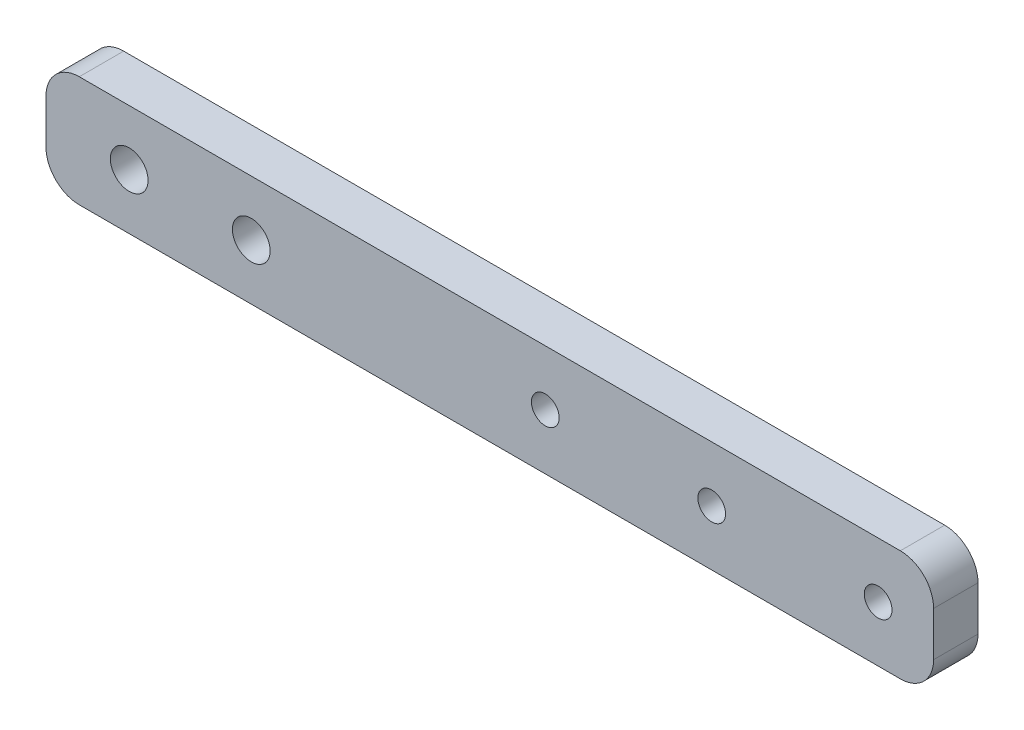
ISO-10303-21;
HEADER;
FILE_DESCRIPTION(('STEP AP214'),'2;1');
FILE_NAME('part.step','',(''),(''),'','','');
FILE_SCHEMA(('AUTOMOTIVE_DESIGN { 1 0 10303 214 1 1 1 1 }'));
ENDSEC;
DATA;
#1=APPLICATION_CONTEXT('core data for automotive mechanical design processes');
#2=APPLICATION_PROTOCOL_DEFINITION('international standard','automotive_design',2000,#1);
#3=PRODUCT_CONTEXT('',#1,'mechanical');
#4=PRODUCT('Part','Part','',(#3));
#5=PRODUCT_RELATED_PRODUCT_CATEGORY('part','',(#4));
#6=PRODUCT_DEFINITION_FORMATION('','',#4);
#7=PRODUCT_DEFINITION_CONTEXT('part definition',#1,'design');
#8=PRODUCT_DEFINITION('design','',#6,#7);
#9=PRODUCT_DEFINITION_SHAPE('','',#8);
#10=(LENGTH_UNIT() NAMED_UNIT(*) SI_UNIT(.MILLI.,.METRE.));
#11=(NAMED_UNIT(*) PLANE_ANGLE_UNIT() SI_UNIT($,.RADIAN.));
#12=(NAMED_UNIT(*) SI_UNIT($,.STERADIAN.) SOLID_ANGLE_UNIT());
#13=UNCERTAINTY_MEASURE_WITH_UNIT(LENGTH_MEASURE(1.E-05),#10,'distance_accuracy_value','');
#14=(GEOMETRIC_REPRESENTATION_CONTEXT(3) GLOBAL_UNCERTAINTY_ASSIGNED_CONTEXT((#13)) GLOBAL_UNIT_ASSIGNED_CONTEXT((#10,
#11,#12)) REPRESENTATION_CONTEXT('',''));
#15=CARTESIAN_POINT('',(0.,0.,0.));
#16=DIRECTION('',(0.,0.,1.));
#17=DIRECTION('',(1.,0.,0.));
#18=AXIS2_PLACEMENT_3D('',#15,#16,#17);
#19=CARTESIAN_POINT('',(0.,0.,4.));
#20=DIRECTION('',(0.,0.,-1.));
#21=DIRECTION('',(-1.,0.,0.));
#22=AXIS2_PLACEMENT_3D('',#19,#20,#21);
#23=PLANE('',#22);
#24=DIRECTION('',(1.,0.,0.));
#25=VECTOR('',#24,1.);
#26=CARTESIAN_POINT('',(0.,0.,4.));
#27=LINE('',#26,#25);
#28=CARTESIAN_POINT('',(3.,0.,4.));
#29=VERTEX_POINT('',#28);
#30=CARTESIAN_POINT('',(77.,0.,4.));
#31=VERTEX_POINT('',#30);
#32=EDGE_CURVE('E177',#29,#31,#27,.T.);
#33=ORIENTED_EDGE('',*,*,#32,.T.);
#34=CARTESIAN_POINT('',(77.,3.00000000000001,4.));
#35=DIRECTION('',(0.,0.,-1.));
#36=DIRECTION('',(-1.,0.,0.));
#37=AXIS2_PLACEMENT_3D('',#34,#35,#36);
#38=CIRCLE('',#37,3.);
#39=CARTESIAN_POINT('',(80.,3.00000000000001,4.));
#40=VERTEX_POINT('',#39);
#41=EDGE_CURVE('E154',#31,#40,#38,.F.);
#42=ORIENTED_EDGE('',*,*,#41,.T.);
#43=DIRECTION('',(0.,1.,0.));
#44=VECTOR('',#43,1.);
#45=CARTESIAN_POINT('',(80.,0.,4.));
#46=LINE('',#45,#44);
#47=CARTESIAN_POINT('',(80.,7.00000000000001,4.));
#48=VERTEX_POINT('',#47);
#49=EDGE_CURVE('E124',#40,#48,#46,.T.);
#50=ORIENTED_EDGE('',*,*,#49,.T.);
#51=CARTESIAN_POINT('',(77.,7.00000000000001,4.));
#52=DIRECTION('',(0.,0.,-1.));
#53=DIRECTION('',(-1.,0.,0.));
#54=AXIS2_PLACEMENT_3D('',#51,#52,#53);
#55=CIRCLE('',#54,3.);
#56=CARTESIAN_POINT('',(77.,10.,4.));
#57=VERTEX_POINT('',#56);
#58=EDGE_CURVE('E61',#48,#57,#55,.F.);
#59=ORIENTED_EDGE('',*,*,#58,.T.);
#60=DIRECTION('',(-1.,0.,0.));
#61=VECTOR('',#60,1.);
#62=CARTESIAN_POINT('',(0.,10.,4.));
#63=LINE('',#62,#61);
#64=CARTESIAN_POINT('',(3.,10.,4.));
#65=VERTEX_POINT('',#64);
#66=EDGE_CURVE('E140',#57,#65,#63,.T.);
#67=ORIENTED_EDGE('',*,*,#66,.T.);
#68=CARTESIAN_POINT('',(3.,7.,4.));
#69=DIRECTION('',(0.,0.,-1.));
#70=DIRECTION('',(-1.,0.,0.));
#71=AXIS2_PLACEMENT_3D('',#68,#69,#70);
#72=CIRCLE('',#71,3.);
#73=CARTESIAN_POINT('',(0.,7.,4.));
#74=VERTEX_POINT('',#73);
#75=EDGE_CURVE('E149',#65,#74,#72,.F.);
#76=ORIENTED_EDGE('',*,*,#75,.T.);
#77=DIRECTION('',(0.,-1.,0.));
#78=VECTOR('',#77,1.);
#79=CARTESIAN_POINT('',(0.,0.,4.));
#80=LINE('',#79,#78);
#81=CARTESIAN_POINT('',(0.,3.,4.));
#82=VERTEX_POINT('',#81);
#83=EDGE_CURVE('E134',#74,#82,#80,.T.);
#84=ORIENTED_EDGE('',*,*,#83,.T.);
#85=CARTESIAN_POINT('',(3.,3.,4.));
#86=DIRECTION('',(0.,0.,-1.));
#87=DIRECTION('',(-1.,0.,0.));
#88=AXIS2_PLACEMENT_3D('',#85,#86,#87);
#89=CIRCLE('',#88,3.);
#90=EDGE_CURVE('E151',#82,#29,#89,.F.);
#91=ORIENTED_EDGE('',*,*,#90,.T.);
#92=EDGE_LOOP('',(#33,#42,#50,#59,#67,#76,#84,#91));
#93=FACE_BOUND('',#92,.T.);
#94=CARTESIAN_POINT('',(45.,5.,4.));
#95=DIRECTION('',(0.,0.,1.));
#96=DIRECTION('',(1.,0.,0.));
#97=AXIS2_PLACEMENT_3D('',#94,#95,#96);
#98=CIRCLE('',#97,1.25);
#99=CARTESIAN_POINT('',(46.25,5.,4.));
#100=VERTEX_POINT('',#99);
#101=EDGE_CURVE('E170',#100,#100,#98,.T.);
#102=ORIENTED_EDGE('',*,*,#101,.F.);
#103=EDGE_LOOP('',(#102));
#104=FACE_BOUND('',#103,.T.);
#105=CARTESIAN_POINT('',(60.,5.,4.));
#106=DIRECTION('',(0.,0.,1.));
#107=DIRECTION('',(1.,0.,0.));
#108=AXIS2_PLACEMENT_3D('',#105,#106,#107);
#109=CIRCLE('',#108,1.25);
#110=CARTESIAN_POINT('',(61.25,5.,4.));
#111=VERTEX_POINT('',#110);
#112=EDGE_CURVE('E182',#111,#111,#109,.T.);
#113=ORIENTED_EDGE('',*,*,#112,.F.);
#114=EDGE_LOOP('',(#113));
#115=FACE_BOUND('',#114,.T.);
#116=CARTESIAN_POINT('',(75.,5.,4.));
#117=DIRECTION('',(0.,0.,1.));
#118=DIRECTION('',(1.,0.,0.));
#119=AXIS2_PLACEMENT_3D('',#116,#117,#118);
#120=CIRCLE('',#119,1.25);
#121=CARTESIAN_POINT('',(76.25,5.,4.));
#122=VERTEX_POINT('',#121);
#123=EDGE_CURVE('E187',#122,#122,#120,.T.);
#124=ORIENTED_EDGE('',*,*,#123,.F.);
#125=EDGE_LOOP('',(#124));
#126=FACE_BOUND('',#125,.T.);
#127=CARTESIAN_POINT('',(7.5,4.99999999999999,4.));
#128=DIRECTION('',(0.,0.,1.));
#129=DIRECTION('',(1.,0.,0.));
#130=AXIS2_PLACEMENT_3D('',#127,#128,#129);
#131=CIRCLE('',#130,1.7);
#132=CARTESIAN_POINT('',(9.2,4.99999999999999,4.));
#133=VERTEX_POINT('',#132);
#134=EDGE_CURVE('E193',#133,#133,#131,.T.);
#135=ORIENTED_EDGE('',*,*,#134,.F.);
#136=EDGE_LOOP('',(#135));
#137=FACE_BOUND('',#136,.T.);
#138=CARTESIAN_POINT('',(18.5,4.99999999999999,4.));
#139=DIRECTION('',(0.,0.,1.));
#140=DIRECTION('',(1.,0.,0.));
#141=AXIS2_PLACEMENT_3D('',#138,#139,#140);
#142=CIRCLE('',#141,1.7);
#143=CARTESIAN_POINT('',(20.2,4.99999999999999,4.));
#144=VERTEX_POINT('',#143);
#145=EDGE_CURVE('E199',#144,#144,#142,.T.);
#146=ORIENTED_EDGE('',*,*,#145,.F.);
#147=EDGE_LOOP('',(#146));
#148=FACE_BOUND('',#147,.T.);
#149=ADVANCED_FACE('F39',(#93,#104,#115,#126,#137,#148),#23,.F.);
#150=CARTESIAN_POINT('',(0.,0.,0.));
#151=DIRECTION('',(0.,0.,-1.));
#152=DIRECTION('',(-1.,0.,0.));
#153=AXIS2_PLACEMENT_3D('',#150,#151,#152);
#154=PLANE('',#153);
#155=CARTESIAN_POINT('',(7.5,4.99999999999999,0.));
#156=DIRECTION('',(0.,0.,1.));
#157=DIRECTION('',(1.,0.,0.));
#158=AXIS2_PLACEMENT_3D('',#155,#156,#157);
#159=CIRCLE('',#158,1.7);
#160=CARTESIAN_POINT('',(9.2,4.99999999999999,0.));
#161=VERTEX_POINT('',#160);
#162=EDGE_CURVE('E196',#161,#161,#159,.T.);
#163=ORIENTED_EDGE('',*,*,#162,.T.);
#164=EDGE_LOOP('',(#163));
#165=FACE_BOUND('',#164,.T.);
#166=CARTESIAN_POINT('',(60.,5.,0.));
#167=DIRECTION('',(0.,0.,1.));
#168=DIRECTION('',(1.,0.,0.));
#169=AXIS2_PLACEMENT_3D('',#166,#167,#168);
#170=CIRCLE('',#169,1.25);
#171=CARTESIAN_POINT('',(61.25,5.,0.));
#172=VERTEX_POINT('',#171);
#173=EDGE_CURVE('E184',#172,#172,#170,.T.);
#174=ORIENTED_EDGE('',*,*,#173,.T.);
#175=EDGE_LOOP('',(#174));
#176=FACE_BOUND('',#175,.T.);
#177=DIRECTION('',(0.,1.,0.));
#178=VECTOR('',#177,1.);
#179=CARTESIAN_POINT('',(80.,0.,0.));
#180=LINE('',#179,#178);
#181=CARTESIAN_POINT('',(80.,3.00000000000001,0.));
#182=VERTEX_POINT('',#181);
#183=CARTESIAN_POINT('',(80.,7.00000000000001,0.));
#184=VERTEX_POINT('',#183);
#185=EDGE_CURVE('E122',#182,#184,#180,.T.);
#186=ORIENTED_EDGE('',*,*,#185,.F.);
#187=CARTESIAN_POINT('',(77.,3.00000000000001,0.));
#188=DIRECTION('',(0.,0.,-1.));
#189=DIRECTION('',(-1.,0.,0.));
#190=AXIS2_PLACEMENT_3D('',#187,#188,#189);
#191=CIRCLE('',#190,3.);
#192=CARTESIAN_POINT('',(77.,0.,0.));
#193=VERTEX_POINT('',#192);
#194=EDGE_CURVE('E105',#182,#193,#191,.T.);
#195=ORIENTED_EDGE('',*,*,#194,.T.);
#196=DIRECTION('',(1.,0.,0.));
#197=VECTOR('',#196,1.);
#198=CARTESIAN_POINT('',(0.,0.,0.));
#199=LINE('',#198,#197);
#200=CARTESIAN_POINT('',(3.,0.,0.));
#201=VERTEX_POINT('',#200);
#202=EDGE_CURVE('E132',#201,#193,#199,.T.);
#203=ORIENTED_EDGE('',*,*,#202,.F.);
#204=CARTESIAN_POINT('',(3.,3.,0.));
#205=DIRECTION('',(0.,0.,-1.));
#206=DIRECTION('',(-1.,0.,0.));
#207=AXIS2_PLACEMENT_3D('',#204,#205,#206);
#208=CIRCLE('',#207,3.);
#209=CARTESIAN_POINT('',(0.,3.,0.));
#210=VERTEX_POINT('',#209);
#211=EDGE_CURVE('E143',#201,#210,#208,.T.);
#212=ORIENTED_EDGE('',*,*,#211,.T.);
#213=DIRECTION('',(0.,-1.,0.));
#214=VECTOR('',#213,1.);
#215=CARTESIAN_POINT('',(0.,0.,0.));
#216=LINE('',#215,#214);
#217=CARTESIAN_POINT('',(0.,7.,0.));
#218=VERTEX_POINT('',#217);
#219=EDGE_CURVE('E136',#218,#210,#216,.T.);
#220=ORIENTED_EDGE('',*,*,#219,.F.);
#221=CARTESIAN_POINT('',(3.,7.,0.));
#222=DIRECTION('',(0.,0.,-1.));
#223=DIRECTION('',(-1.,0.,0.));
#224=AXIS2_PLACEMENT_3D('',#221,#222,#223);
#225=CIRCLE('',#224,3.);
#226=CARTESIAN_POINT('',(3.,10.,0.));
#227=VERTEX_POINT('',#226);
#228=EDGE_CURVE('E125',#218,#227,#225,.T.);
#229=ORIENTED_EDGE('',*,*,#228,.T.);
#230=DIRECTION('',(-1.,0.,0.));
#231=VECTOR('',#230,1.);
#232=CARTESIAN_POINT('',(0.,10.,0.));
#233=LINE('',#232,#231);
#234=CARTESIAN_POINT('',(77.,10.,0.));
#235=VERTEX_POINT('',#234);
#236=EDGE_CURVE('E131',#235,#227,#233,.T.);
#237=ORIENTED_EDGE('',*,*,#236,.F.);
#238=CARTESIAN_POINT('',(77.,7.00000000000001,0.));
#239=DIRECTION('',(0.,0.,-1.));
#240=DIRECTION('',(-1.,0.,0.));
#241=AXIS2_PLACEMENT_3D('',#238,#239,#240);
#242=CIRCLE('',#241,3.);
#243=EDGE_CURVE('E116',#235,#184,#242,.T.);
#244=ORIENTED_EDGE('',*,*,#243,.T.);
#245=EDGE_LOOP('',(#186,#195,#203,#212,#220,#229,#237,#244));
#246=FACE_BOUND('',#245,.T.);
#247=CARTESIAN_POINT('',(45.,5.,0.));
#248=DIRECTION('',(0.,0.,1.));
#249=DIRECTION('',(1.,0.,0.));
#250=AXIS2_PLACEMENT_3D('',#247,#248,#249);
#251=CIRCLE('',#250,1.25);
#252=CARTESIAN_POINT('',(46.25,5.,0.));
#253=VERTEX_POINT('',#252);
#254=EDGE_CURVE('E172',#253,#253,#251,.T.);
#255=ORIENTED_EDGE('',*,*,#254,.T.);
#256=EDGE_LOOP('',(#255));
#257=FACE_BOUND('',#256,.T.);
#258=CARTESIAN_POINT('',(75.,5.,0.));
#259=DIRECTION('',(0.,0.,1.));
#260=DIRECTION('',(1.,0.,0.));
#261=AXIS2_PLACEMENT_3D('',#258,#259,#260);
#262=CIRCLE('',#261,1.25);
#263=CARTESIAN_POINT('',(76.25,5.,0.));
#264=VERTEX_POINT('',#263);
#265=EDGE_CURVE('E190',#264,#264,#262,.T.);
#266=ORIENTED_EDGE('',*,*,#265,.T.);
#267=EDGE_LOOP('',(#266));
#268=FACE_BOUND('',#267,.T.);
#269=CARTESIAN_POINT('',(18.5,4.99999999999999,0.));
#270=DIRECTION('',(0.,0.,1.));
#271=DIRECTION('',(1.,0.,0.));
#272=AXIS2_PLACEMENT_3D('',#269,#270,#271);
#273=CIRCLE('',#272,1.7);
#274=CARTESIAN_POINT('',(20.2,4.99999999999999,0.));
#275=VERTEX_POINT('',#274);
#276=EDGE_CURVE('E202',#275,#275,#273,.T.);
#277=ORIENTED_EDGE('',*,*,#276,.T.);
#278=EDGE_LOOP('',(#277));
#279=FACE_BOUND('',#278,.T.);
#280=ADVANCED_FACE('F128',(#165,#176,#246,#257,#268,#279),#154,.T.);
#281=CARTESIAN_POINT('',(0.,0.,4.));
#282=DIRECTION('',(1.,0.,0.));
#283=DIRECTION('',(0.,0.,-1.));
#284=AXIS2_PLACEMENT_3D('',#281,#282,#283);
#285=PLANE('',#284);
#286=ORIENTED_EDGE('',*,*,#219,.T.);
#287=DIRECTION('',(0.,0.,-1.));
#288=VECTOR('',#287,1.);
#289=CARTESIAN_POINT('',(0.,3.,4.));
#290=LINE('',#289,#288);
#291=EDGE_CURVE('E11',#210,#82,#290,.F.);
#292=ORIENTED_EDGE('',*,*,#291,.T.);
#293=ORIENTED_EDGE('',*,*,#83,.F.);
#294=DIRECTION('',(0.,0.,-1.));
#295=VECTOR('',#294,1.);
#296=CARTESIAN_POINT('',(0.,7.,4.));
#297=LINE('',#296,#295);
#298=EDGE_CURVE('E47',#74,#218,#297,.T.);
#299=ORIENTED_EDGE('',*,*,#298,.T.);
#300=EDGE_LOOP('',(#286,#292,#293,#299));
#301=FACE_BOUND('',#300,.T.);
#302=ADVANCED_FACE('F165',(#301),#285,.F.);
#303=CARTESIAN_POINT('',(0.,0.,4.));
#304=DIRECTION('',(0.,1.,0.));
#305=DIRECTION('',(-1.,0.,0.));
#306=AXIS2_PLACEMENT_3D('',#303,#304,#305);
#307=PLANE('',#306);
#308=ORIENTED_EDGE('',*,*,#202,.T.);
#309=DIRECTION('',(0.,0.,-1.));
#310=VECTOR('',#309,1.);
#311=CARTESIAN_POINT('',(77.,0.,4.));
#312=LINE('',#311,#310);
#313=EDGE_CURVE('E110',#193,#31,#312,.F.);
#314=ORIENTED_EDGE('',*,*,#313,.T.);
#315=ORIENTED_EDGE('',*,*,#32,.F.);
#316=DIRECTION('',(0.,0.,-1.));
#317=VECTOR('',#316,1.);
#318=CARTESIAN_POINT('',(3.,0.,4.));
#319=LINE('',#318,#317);
#320=EDGE_CURVE('E115',#29,#201,#319,.T.);
#321=ORIENTED_EDGE('',*,*,#320,.T.);
#322=EDGE_LOOP('',(#308,#314,#315,#321));
#323=FACE_BOUND('',#322,.T.);
#324=ADVANCED_FACE('F229',(#323),#307,.F.);
#325=CARTESIAN_POINT('',(80.,0.,4.));
#326=DIRECTION('',(-1.,0.,0.));
#327=DIRECTION('',(0.,0.,1.));
#328=AXIS2_PLACEMENT_3D('',#325,#326,#327);
#329=PLANE('',#328);
#330=ORIENTED_EDGE('',*,*,#49,.F.);
#331=DIRECTION('',(0.,0.,-1.));
#332=VECTOR('',#331,1.);
#333=CARTESIAN_POINT('',(80.,3.00000000000001,4.));
#334=LINE('',#333,#332);
#335=EDGE_CURVE('E109',#40,#182,#334,.T.);
#336=ORIENTED_EDGE('',*,*,#335,.T.);
#337=ORIENTED_EDGE('',*,*,#185,.T.);
#338=DIRECTION('',(0.,0.,-1.));
#339=VECTOR('',#338,1.);
#340=CARTESIAN_POINT('',(80.,7.00000000000001,4.));
#341=LINE('',#340,#339);
#342=EDGE_CURVE('E126',#184,#48,#341,.F.);
#343=ORIENTED_EDGE('',*,*,#342,.T.);
#344=EDGE_LOOP('',(#330,#336,#337,#343));
#345=FACE_BOUND('',#344,.T.);
#346=ADVANCED_FACE('F121',(#345),#329,.F.);
#347=CARTESIAN_POINT('',(0.,10.,4.));
#348=DIRECTION('',(0.,-1.,0.));
#349=DIRECTION('',(1.,0.,0.));
#350=AXIS2_PLACEMENT_3D('',#347,#348,#349);
#351=PLANE('',#350);
#352=ORIENTED_EDGE('',*,*,#66,.F.);
#353=DIRECTION('',(0.,0.,-1.));
#354=VECTOR('',#353,1.);
#355=CARTESIAN_POINT('',(77.,10.,4.));
#356=LINE('',#355,#354);
#357=EDGE_CURVE('E157',#57,#235,#356,.T.);
#358=ORIENTED_EDGE('',*,*,#357,.T.);
#359=ORIENTED_EDGE('',*,*,#236,.T.);
#360=DIRECTION('',(0.,0.,-1.));
#361=VECTOR('',#360,1.);
#362=CARTESIAN_POINT('',(3.,10.,4.));
#363=LINE('',#362,#361);
#364=EDGE_CURVE('E54',#227,#65,#363,.F.);
#365=ORIENTED_EDGE('',*,*,#364,.T.);
#366=EDGE_LOOP('',(#352,#358,#359,#365));
#367=FACE_BOUND('',#366,.T.);
#368=ADVANCED_FACE('F224',(#367),#351,.F.);
#369=CARTESIAN_POINT('',(45.,5.,4.));
#370=DIRECTION('',(0.,0.,-1.));
#371=DIRECTION('',(-1.,0.,0.));
#372=AXIS2_PLACEMENT_3D('',#369,#370,#371);
#373=CYLINDRICAL_SURFACE('',#372,1.25);
#374=ORIENTED_EDGE('',*,*,#101,.T.);
#375=EDGE_LOOP('',(#374));
#376=FACE_BOUND('',#375,.T.);
#377=ORIENTED_EDGE('',*,*,#254,.F.);
#378=EDGE_LOOP('',(#377));
#379=FACE_BOUND('',#378,.T.);
#380=ADVANCED_FACE('F221',(#376,#379),#373,.F.);
#381=CARTESIAN_POINT('',(60.,5.,4.));
#382=DIRECTION('',(0.,0.,-1.));
#383=DIRECTION('',(-1.,0.,0.));
#384=AXIS2_PLACEMENT_3D('',#381,#382,#383);
#385=CYLINDRICAL_SURFACE('',#384,1.25);
#386=ORIENTED_EDGE('',*,*,#112,.T.);
#387=EDGE_LOOP('',(#386));
#388=FACE_BOUND('',#387,.T.);
#389=ORIENTED_EDGE('',*,*,#173,.F.);
#390=EDGE_LOOP('',(#389));
#391=FACE_BOUND('',#390,.T.);
#392=ADVANCED_FACE('F296',(#388,#391),#385,.F.);
#393=CARTESIAN_POINT('',(75.,5.,4.));
#394=DIRECTION('',(0.,0.,-1.));
#395=DIRECTION('',(-1.,0.,0.));
#396=AXIS2_PLACEMENT_3D('',#393,#394,#395);
#397=CYLINDRICAL_SURFACE('',#396,1.25);
#398=ORIENTED_EDGE('',*,*,#123,.T.);
#399=EDGE_LOOP('',(#398));
#400=FACE_BOUND('',#399,.T.);
#401=ORIENTED_EDGE('',*,*,#265,.F.);
#402=EDGE_LOOP('',(#401));
#403=FACE_BOUND('',#402,.T.);
#404=ADVANCED_FACE('F286',(#400,#403),#397,.F.);
#405=CARTESIAN_POINT('',(7.5,4.99999999999999,4.));
#406=DIRECTION('',(0.,0.,-1.));
#407=DIRECTION('',(-1.,0.,0.));
#408=AXIS2_PLACEMENT_3D('',#405,#406,#407);
#409=CYLINDRICAL_SURFACE('',#408,1.7);
#410=ORIENTED_EDGE('',*,*,#134,.T.);
#411=EDGE_LOOP('',(#410));
#412=FACE_BOUND('',#411,.T.);
#413=ORIENTED_EDGE('',*,*,#162,.F.);
#414=EDGE_LOOP('',(#413));
#415=FACE_BOUND('',#414,.T.);
#416=ADVANCED_FACE('F277',(#412,#415),#409,.F.);
#417=CARTESIAN_POINT('',(18.5,4.99999999999999,4.));
#418=DIRECTION('',(0.,0.,-1.));
#419=DIRECTION('',(-1.,0.,0.));
#420=AXIS2_PLACEMENT_3D('',#417,#418,#419);
#421=CYLINDRICAL_SURFACE('',#420,1.7);
#422=ORIENTED_EDGE('',*,*,#145,.T.);
#423=EDGE_LOOP('',(#422));
#424=FACE_BOUND('',#423,.T.);
#425=ORIENTED_EDGE('',*,*,#276,.F.);
#426=EDGE_LOOP('',(#425));
#427=FACE_BOUND('',#426,.T.);
#428=ADVANCED_FACE('F208',(#424,#427),#421,.F.);
#429=CARTESIAN_POINT('',(77.,3.00000000000001,4.));
#430=DIRECTION('',(0.,0.,-1.));
#431=DIRECTION('',(-1.,0.,0.));
#432=AXIS2_PLACEMENT_3D('',#429,#430,#431);
#433=CYLINDRICAL_SURFACE('',#432,3.);
#434=ORIENTED_EDGE('',*,*,#41,.F.);
#435=ORIENTED_EDGE('',*,*,#313,.F.);
#436=ORIENTED_EDGE('',*,*,#194,.F.);
#437=ORIENTED_EDGE('',*,*,#335,.F.);
#438=EDGE_LOOP('',(#434,#435,#436,#437));
#439=FACE_BOUND('',#438,.T.);
#440=ADVANCED_FACE('F108',(#439),#433,.T.);
#441=CARTESIAN_POINT('',(77.,7.00000000000001,4.));
#442=DIRECTION('',(0.,0.,-1.));
#443=DIRECTION('',(-1.,0.,0.));
#444=AXIS2_PLACEMENT_3D('',#441,#442,#443);
#445=CYLINDRICAL_SURFACE('',#444,3.);
#446=ORIENTED_EDGE('',*,*,#58,.F.);
#447=ORIENTED_EDGE('',*,*,#342,.F.);
#448=ORIENTED_EDGE('',*,*,#243,.F.);
#449=ORIENTED_EDGE('',*,*,#357,.F.);
#450=EDGE_LOOP('',(#446,#447,#448,#449));
#451=FACE_BOUND('',#450,.T.);
#452=ADVANCED_FACE('F237',(#451),#445,.T.);
#453=CARTESIAN_POINT('',(3.,3.,4.));
#454=DIRECTION('',(0.,0.,-1.));
#455=DIRECTION('',(-1.,0.,0.));
#456=AXIS2_PLACEMENT_3D('',#453,#454,#455);
#457=CYLINDRICAL_SURFACE('',#456,3.);
#458=ORIENTED_EDGE('',*,*,#90,.F.);
#459=ORIENTED_EDGE('',*,*,#291,.F.);
#460=ORIENTED_EDGE('',*,*,#211,.F.);
#461=ORIENTED_EDGE('',*,*,#320,.F.);
#462=EDGE_LOOP('',(#458,#459,#460,#461));
#463=FACE_BOUND('',#462,.T.);
#464=ADVANCED_FACE('F239',(#463),#457,.T.);
#465=CARTESIAN_POINT('',(3.,7.,4.));
#466=DIRECTION('',(0.,0.,-1.));
#467=DIRECTION('',(-1.,0.,0.));
#468=AXIS2_PLACEMENT_3D('',#465,#466,#467);
#469=CYLINDRICAL_SURFACE('',#468,3.);
#470=ORIENTED_EDGE('',*,*,#75,.F.);
#471=ORIENTED_EDGE('',*,*,#364,.F.);
#472=ORIENTED_EDGE('',*,*,#228,.F.);
#473=ORIENTED_EDGE('',*,*,#298,.F.);
#474=EDGE_LOOP('',(#470,#471,#472,#473));
#475=FACE_BOUND('',#474,.T.);
#476=ADVANCED_FACE('F41',(#475),#469,.T.);
#477=CLOSED_SHELL('',(#149,#280,#302,#324,#346,#368,#380,#392,#404,#416,#428,#440,#452,#464,#476));
#478=MANIFOLD_SOLID_BREP('B2',#477);
#479=ADVANCED_BREP_SHAPE_REPRESENTATION('',(#18,#478),#14);
#480=SHAPE_DEFINITION_REPRESENTATION(#9,#479);
ENDSEC;
END-ISO-10303-21;
